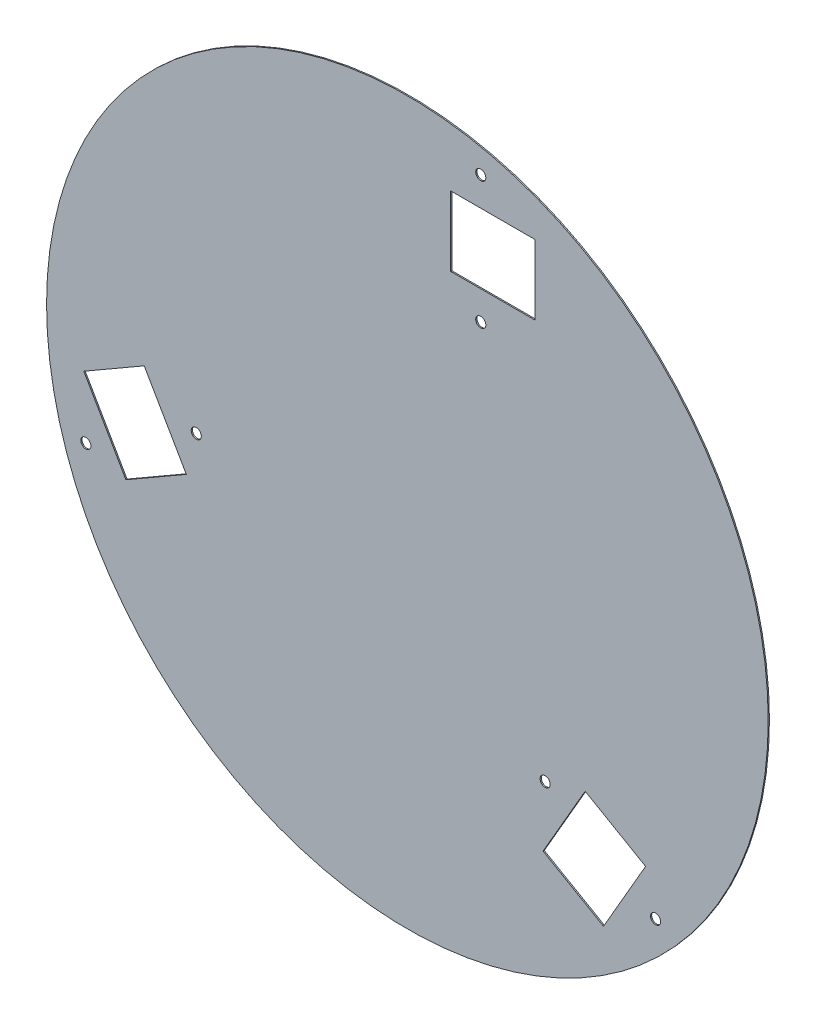
ISO-10303-21;
HEADER;
FILE_DESCRIPTION(('STEP AP214'),'2;1');
FILE_NAME('part.step','',(''),(''),'','','');
FILE_SCHEMA(('AUTOMOTIVE_DESIGN { 1 0 10303 214 1 1 1 1 }'));
ENDSEC;
DATA;
#1=APPLICATION_CONTEXT('core data for automotive mechanical design processes');
#2=APPLICATION_PROTOCOL_DEFINITION('international standard','automotive_design',2000,#1);
#3=PRODUCT_CONTEXT('',#1,'mechanical');
#4=PRODUCT('Part','Part','',(#3));
#5=PRODUCT_RELATED_PRODUCT_CATEGORY('part','',(#4));
#6=PRODUCT_DEFINITION_FORMATION('','',#4);
#7=PRODUCT_DEFINITION_CONTEXT('part definition',#1,'design');
#8=PRODUCT_DEFINITION('design','',#6,#7);
#9=PRODUCT_DEFINITION_SHAPE('','',#8);
#10=(LENGTH_UNIT() NAMED_UNIT(*) SI_UNIT(.MILLI.,.METRE.));
#11=(NAMED_UNIT(*) PLANE_ANGLE_UNIT() SI_UNIT($,.RADIAN.));
#12=(NAMED_UNIT(*) SI_UNIT($,.STERADIAN.) SOLID_ANGLE_UNIT());
#13=UNCERTAINTY_MEASURE_WITH_UNIT(LENGTH_MEASURE(1.E-05),#10,'distance_accuracy_value','');
#14=(GEOMETRIC_REPRESENTATION_CONTEXT(3) GLOBAL_UNCERTAINTY_ASSIGNED_CONTEXT((#13)) GLOBAL_UNIT_ASSIGNED_CONTEXT((#10,
#11,#12)) REPRESENTATION_CONTEXT('',''));
#15=CARTESIAN_POINT('',(0.,0.,0.));
#16=DIRECTION('',(0.,0.,1.));
#17=DIRECTION('',(1.,0.,0.));
#18=AXIS2_PLACEMENT_3D('',#15,#16,#17);
#19=CARTESIAN_POINT('',(0.,0.,0.5));
#20=DIRECTION('',(0.,0.,-1.));
#21=DIRECTION('',(-1.,0.,0.));
#22=AXIS2_PLACEMENT_3D('',#19,#20,#21);
#23=CYLINDRICAL_SURFACE('',#22,150.);
#24=CARTESIAN_POINT('',(0.,0.,0.5));
#25=DIRECTION('',(0.,0.,1.));
#26=DIRECTION('',(1.,0.,0.));
#27=AXIS2_PLACEMENT_3D('',#24,#25,#26);
#28=CIRCLE('',#27,150.);
#29=CARTESIAN_POINT('',(150.,0.,0.5));
#30=VERTEX_POINT('',#29);
#31=EDGE_CURVE('E198',#30,#30,#28,.T.);
#32=ORIENTED_EDGE('',*,*,#31,.F.);
#33=EDGE_LOOP('',(#32));
#34=FACE_BOUND('',#33,.T.);
#35=CARTESIAN_POINT('',(0.,0.,0.));
#36=DIRECTION('',(0.,0.,1.));
#37=DIRECTION('',(1.,0.,0.));
#38=AXIS2_PLACEMENT_3D('',#35,#36,#37);
#39=CIRCLE('',#38,150.);
#40=CARTESIAN_POINT('',(150.,0.,0.));
#41=VERTEX_POINT('',#40);
#42=EDGE_CURVE('E156',#41,#41,#39,.T.);
#43=ORIENTED_EDGE('',*,*,#42,.T.);
#44=EDGE_LOOP('',(#43));
#45=FACE_BOUND('',#44,.T.);
#46=ADVANCED_FACE('F37',(#34,#45),#23,.T.);
#47=CARTESIAN_POINT('',(0.,0.,0.5));
#48=DIRECTION('',(0.,0.,1.));
#49=DIRECTION('',(1.,0.,0.));
#50=AXIS2_PLACEMENT_3D('',#47,#48,#49);
#51=PLANE('',#50);
#52=CARTESIAN_POINT('',(-133.660108094979,-41.9503329679836,0.5));
#53=DIRECTION('',(0.,0.,1.));
#54=DIRECTION('',(1.,0.,0.));
#55=AXIS2_PLACEMENT_3D('',#52,#53,#54);
#56=CIRCLE('',#55,2.09999999999999);
#57=CARTESIAN_POINT('',(-131.560108094979,-41.9503329679836,0.5));
#58=VERTEX_POINT('',#57);
#59=EDGE_CURVE('E426',#58,#58,#56,.T.);
#60=ORIENTED_EDGE('',*,*,#59,.F.);
#61=EDGE_LOOP('',(#60));
#62=FACE_BOUND('',#61,.T.);
#63=CARTESIAN_POINT('',(57.2607616944042,-68.2778825988343,0.5));
#64=DIRECTION('',(0.,0.,1.));
#65=DIRECTION('',(1.,0.,0.));
#66=AXIS2_PLACEMENT_3D('',#63,#64,#65);
#67=CIRCLE('',#66,2.1);
#68=CARTESIAN_POINT('',(59.3607616944042,-68.2778825988343,0.5));
#69=VERTEX_POINT('',#68);
#70=EDGE_CURVE('E438',#69,#69,#67,.T.);
#71=ORIENTED_EDGE('',*,*,#70,.F.);
#72=EDGE_LOOP('',(#71));
#73=FACE_BOUND('',#72,.T.);
#74=CARTESIAN_POINT('',(-87.7607616944041,-15.4503329679836,0.5));
#75=DIRECTION('',(0.,0.,1.));
#76=DIRECTION('',(1.,0.,0.));
#77=AXIS2_PLACEMENT_3D('',#74,#75,#76);
#78=CIRCLE('',#77,2.1);
#79=CARTESIAN_POINT('',(-85.6607616944041,-15.4503329679836,0.5));
#80=VERTEX_POINT('',#79);
#81=EDGE_CURVE('E431',#80,#80,#78,.T.);
#82=ORIENTED_EDGE('',*,*,#81,.F.);
#83=EDGE_LOOP('',(#82));
#84=FACE_BOUND('',#83,.T.);
#85=CARTESIAN_POINT('',(30.5,136.728215566818,0.5));
#86=DIRECTION('',(0.,0.,1.));
#87=DIRECTION('',(1.,0.,0.));
#88=AXIS2_PLACEMENT_3D('',#85,#86,#87);
#89=CIRCLE('',#88,2.09999999999999);
#90=CARTESIAN_POINT('',(32.6,136.728215566818,0.5));
#91=VERTEX_POINT('',#90);
#92=EDGE_CURVE('E444',#91,#91,#89,.T.);
#93=ORIENTED_EDGE('',*,*,#92,.F.);
#94=EDGE_LOOP('',(#93));
#95=FACE_BOUND('',#94,.T.);
#96=CARTESIAN_POINT('',(30.5,83.728215566818,0.5));
#97=DIRECTION('',(0.,0.,1.));
#98=DIRECTION('',(1.,0.,0.));
#99=AXIS2_PLACEMENT_3D('',#96,#97,#98);
#100=CIRCLE('',#99,2.1);
#101=CARTESIAN_POINT('',(32.6,83.728215566818,0.5));
#102=VERTEX_POINT('',#101);
#103=EDGE_CURVE('E445',#102,#102,#100,.T.);
#104=ORIENTED_EDGE('',*,*,#103,.F.);
#105=EDGE_LOOP('',(#104));
#106=FACE_BOUND('',#105,.T.);
#107=CARTESIAN_POINT('',(103.160108094979,-94.7778825988344,0.5));
#108=DIRECTION('',(0.,0.,1.));
#109=DIRECTION('',(1.,0.,0.));
#110=AXIS2_PLACEMENT_3D('',#107,#108,#109);
#111=CIRCLE('',#110,2.1);
#112=CARTESIAN_POINT('',(105.26010809498,-94.7778825988344,0.5));
#113=VERTEX_POINT('',#112);
#114=EDGE_CURVE('E437',#113,#113,#111,.T.);
#115=ORIENTED_EDGE('',*,*,#114,.F.);
#116=EDGE_LOOP('',(#115));
#117=FACE_BOUND('',#116,.T.);
#118=DIRECTION('',(0.,-1.,0.));
#119=VECTOR('',#118,1.);
#120=CARTESIAN_POINT('',(18.,124.728215566818,0.5));
#121=LINE('',#120,#119);
#122=CARTESIAN_POINT('',(18.,124.728215566818,0.5));
#123=VERTEX_POINT('',#122);
#124=CARTESIAN_POINT('',(18.,95.728215566818,0.5));
#125=VERTEX_POINT('',#124);
#126=EDGE_CURVE('E51',#123,#125,#121,.T.);
#127=ORIENTED_EDGE('',*,*,#126,.F.);
#128=DIRECTION('',(-1.,0.,0.));
#129=VECTOR('',#128,1.);
#130=CARTESIAN_POINT('',(18.,124.728215566818,0.5));
#131=LINE('',#130,#129);
#132=CARTESIAN_POINT('',(53.,124.728215566818,0.5));
#133=VERTEX_POINT('',#132);
#134=EDGE_CURVE('E149',#133,#123,#131,.T.);
#135=ORIENTED_EDGE('',*,*,#134,.F.);
#136=DIRECTION('',(0.,1.,0.));
#137=VECTOR('',#136,1.);
#138=CARTESIAN_POINT('',(53.,124.728215566818,0.5));
#139=LINE('',#138,#137);
#140=CARTESIAN_POINT('',(53.,95.728215566818,0.5));
#141=VERTEX_POINT('',#140);
#142=EDGE_CURVE('E132',#141,#133,#139,.T.);
#143=ORIENTED_EDGE('',*,*,#142,.F.);
#144=DIRECTION('',(1.,0.,0.));
#145=VECTOR('',#144,1.);
#146=CARTESIAN_POINT('',(18.,95.728215566818,0.5));
#147=LINE('',#146,#145);
#148=EDGE_CURVE('E142',#125,#141,#147,.T.);
#149=ORIENTED_EDGE('',*,*,#148,.F.);
#150=EDGE_LOOP('',(#127,#135,#143,#149));
#151=FACE_BOUND('',#150,.T.);
#152=DIRECTION('',(-0.86602540378444,0.499999999999998,0.));
#153=VECTOR('',#152,1.);
#154=CARTESIAN_POINT('',(99.0178032495662,-77.9525650515289,0.5));
#155=LINE('',#154,#153);
#156=CARTESIAN_POINT('',(99.0178032495662,-77.9525650515289,0.5));
#157=VERTEX_POINT('',#156);
#158=CARTESIAN_POINT('',(73.9030665398174,-63.4525650515289,0.5));
#159=VERTEX_POINT('',#158);
#160=EDGE_CURVE('E59',#157,#159,#155,.T.);
#161=ORIENTED_EDGE('',*,*,#160,.F.);
#162=DIRECTION('',(0.499999999999998,0.86602540378444,0.));
#163=VECTOR('',#162,1.);
#164=CARTESIAN_POINT('',(81.5178032495662,-108.263454183984,0.5));
#165=LINE('',#164,#163);
#166=CARTESIAN_POINT('',(81.5178032495662,-108.263454183984,0.5));
#167=VERTEX_POINT('',#166);
#168=EDGE_CURVE('E167',#167,#157,#165,.T.);
#169=ORIENTED_EDGE('',*,*,#168,.F.);
#170=DIRECTION('',(0.86602540378444,-0.499999999999998,0.));
#171=VECTOR('',#170,1.);
#172=CARTESIAN_POINT('',(56.4030665398175,-93.7634541839843,0.5));
#173=LINE('',#172,#171);
#174=CARTESIAN_POINT('',(56.4030665398175,-93.7634541839843,0.5));
#175=VERTEX_POINT('',#174);
#176=EDGE_CURVE('E164',#175,#167,#173,.T.);
#177=ORIENTED_EDGE('',*,*,#176,.F.);
#178=DIRECTION('',(-0.499999999999998,-0.86602540378444,0.));
#179=VECTOR('',#178,1.);
#180=CARTESIAN_POINT('',(73.9030665398174,-63.4525650515289,0.5));
#181=LINE('',#180,#179);
#182=EDGE_CURVE('E160',#159,#175,#181,.T.);
#183=ORIENTED_EDGE('',*,*,#182,.F.);
#184=EDGE_LOOP('',(#161,#169,#177,#183));
#185=FACE_BOUND('',#184,.T.);
#186=DIRECTION('',(-0.866025403784439,-0.499999999999999,0.));
#187=VECTOR('',#186,1.);
#188=CARTESIAN_POINT('',(-134.517803249566,-16.4647613828338,0.5));
#189=LINE('',#188,#187);
#190=CARTESIAN_POINT('',(-109.403066539817,-1.9647613828338,0.5));
#191=VERTEX_POINT('',#190);
#192=CARTESIAN_POINT('',(-134.517803249566,-16.4647613828338,0.5));
#193=VERTEX_POINT('',#192);
#194=EDGE_CURVE('E178',#191,#193,#189,.T.);
#195=ORIENTED_EDGE('',*,*,#194,.F.);
#196=DIRECTION('',(-0.5,0.866025403784439,0.));
#197=VECTOR('',#196,1.);
#198=CARTESIAN_POINT('',(-109.403066539817,-1.9647613828338,0.5));
#199=LINE('',#198,#197);
#200=CARTESIAN_POINT('',(-91.9030665398173,-32.2756505152891,0.5));
#201=VERTEX_POINT('',#200);
#202=EDGE_CURVE('E187',#201,#191,#199,.T.);
#203=ORIENTED_EDGE('',*,*,#202,.F.);
#204=DIRECTION('',(0.866025403784439,0.5,0.));
#205=VECTOR('',#204,1.);
#206=CARTESIAN_POINT('',(-91.9030665398173,-32.2756505152891,0.5));
#207=LINE('',#206,#205);
#208=CARTESIAN_POINT('',(-117.017803249566,-46.7756505152891,0.5));
#209=VERTEX_POINT('',#208);
#210=EDGE_CURVE('E184',#209,#201,#207,.T.);
#211=ORIENTED_EDGE('',*,*,#210,.F.);
#212=DIRECTION('',(0.5,-0.866025403784439,0.));
#213=VECTOR('',#212,1.);
#214=CARTESIAN_POINT('',(-117.017803249566,-46.7756505152891,0.5));
#215=LINE('',#214,#213);
#216=EDGE_CURVE('E180',#193,#209,#215,.T.);
#217=ORIENTED_EDGE('',*,*,#216,.F.);
#218=EDGE_LOOP('',(#195,#203,#211,#217));
#219=FACE_BOUND('',#218,.T.);
#220=ORIENTED_EDGE('',*,*,#31,.T.);
#221=EDGE_LOOP('',(#220));
#222=FACE_BOUND('',#221,.T.);
#223=ADVANCED_FACE('F146',(#62,#73,#84,#95,#106,#117,#151,#185,#219,#222),#51,.T.);
#224=CARTESIAN_POINT('',(0.,0.,0.));
#225=DIRECTION('',(0.,0.,1.));
#226=DIRECTION('',(1.,0.,0.));
#227=AXIS2_PLACEMENT_3D('',#224,#225,#226);
#228=PLANE('',#227);
#229=CARTESIAN_POINT('',(-133.660108094979,-41.9503329679836,0.));
#230=DIRECTION('',(0.,0.,1.));
#231=DIRECTION('',(1.,0.,0.));
#232=AXIS2_PLACEMENT_3D('',#229,#230,#231);
#233=CIRCLE('',#232,2.09999999999999);
#234=CARTESIAN_POINT('',(-131.560108094979,-41.9503329679836,0.));
#235=VERTEX_POINT('',#234);
#236=EDGE_CURVE('E181',#235,#235,#233,.T.);
#237=ORIENTED_EDGE('',*,*,#236,.T.);
#238=EDGE_LOOP('',(#237));
#239=FACE_BOUND('',#238,.T.);
#240=CARTESIAN_POINT('',(57.2607616944042,-68.2778825988343,0.));
#241=DIRECTION('',(0.,0.,1.));
#242=DIRECTION('',(1.,0.,0.));
#243=AXIS2_PLACEMENT_3D('',#240,#241,#242);
#244=CIRCLE('',#243,2.1);
#245=CARTESIAN_POINT('',(59.3607616944042,-68.2778825988343,0.));
#246=VERTEX_POINT('',#245);
#247=EDGE_CURVE('E434',#246,#246,#244,.T.);
#248=ORIENTED_EDGE('',*,*,#247,.T.);
#249=EDGE_LOOP('',(#248));
#250=FACE_BOUND('',#249,.T.);
#251=CARTESIAN_POINT('',(-87.7607616944041,-15.4503329679836,0.));
#252=DIRECTION('',(0.,0.,1.));
#253=DIRECTION('',(1.,0.,0.));
#254=AXIS2_PLACEMENT_3D('',#251,#252,#253);
#255=CIRCLE('',#254,2.1);
#256=CARTESIAN_POINT('',(-85.6607616944041,-15.4503329679836,0.));
#257=VERTEX_POINT('',#256);
#258=EDGE_CURVE('E427',#257,#257,#255,.T.);
#259=ORIENTED_EDGE('',*,*,#258,.T.);
#260=EDGE_LOOP('',(#259));
#261=FACE_BOUND('',#260,.T.);
#262=CARTESIAN_POINT('',(30.5,136.728215566818,0.));
#263=DIRECTION('',(0.,0.,1.));
#264=DIRECTION('',(1.,0.,0.));
#265=AXIS2_PLACEMENT_3D('',#262,#263,#264);
#266=CIRCLE('',#265,2.09999999999999);
#267=CARTESIAN_POINT('',(32.6,136.728215566818,0.));
#268=VERTEX_POINT('',#267);
#269=EDGE_CURVE('E455',#268,#268,#266,.T.);
#270=ORIENTED_EDGE('',*,*,#269,.T.);
#271=EDGE_LOOP('',(#270));
#272=FACE_BOUND('',#271,.T.);
#273=CARTESIAN_POINT('',(30.5,83.728215566818,0.));
#274=DIRECTION('',(0.,0.,1.));
#275=DIRECTION('',(1.,0.,0.));
#276=AXIS2_PLACEMENT_3D('',#273,#274,#275);
#277=CIRCLE('',#276,2.1);
#278=CARTESIAN_POINT('',(32.6,83.728215566818,0.));
#279=VERTEX_POINT('',#278);
#280=EDGE_CURVE('E441',#279,#279,#277,.T.);
#281=ORIENTED_EDGE('',*,*,#280,.T.);
#282=EDGE_LOOP('',(#281));
#283=FACE_BOUND('',#282,.T.);
#284=CARTESIAN_POINT('',(103.160108094979,-94.7778825988344,0.));
#285=DIRECTION('',(0.,0.,1.));
#286=DIRECTION('',(1.,0.,0.));
#287=AXIS2_PLACEMENT_3D('',#284,#285,#286);
#288=CIRCLE('',#287,2.1);
#289=CARTESIAN_POINT('',(105.26010809498,-94.7778825988344,0.));
#290=VERTEX_POINT('',#289);
#291=EDGE_CURVE('E448',#290,#290,#288,.T.);
#292=ORIENTED_EDGE('',*,*,#291,.T.);
#293=EDGE_LOOP('',(#292));
#294=FACE_BOUND('',#293,.T.);
#295=DIRECTION('',(-1.,0.,0.));
#296=VECTOR('',#295,1.);
#297=CARTESIAN_POINT('',(0.,124.728215566818,0.));
#298=LINE('',#297,#296);
#299=CARTESIAN_POINT('',(53.,124.728215566818,0.));
#300=VERTEX_POINT('',#299);
#301=CARTESIAN_POINT('',(18.,124.728215566818,0.));
#302=VERTEX_POINT('',#301);
#303=EDGE_CURVE('E44',#300,#302,#298,.T.);
#304=ORIENTED_EDGE('',*,*,#303,.T.);
#305=DIRECTION('',(0.,-1.,0.));
#306=VECTOR('',#305,1.);
#307=CARTESIAN_POINT('',(18.,0.,0.));
#308=LINE('',#307,#306);
#309=CARTESIAN_POINT('',(18.,95.728215566818,0.));
#310=VERTEX_POINT('',#309);
#311=EDGE_CURVE('E11',#302,#310,#308,.T.);
#312=ORIENTED_EDGE('',*,*,#311,.T.);
#313=DIRECTION('',(1.,0.,0.));
#314=VECTOR('',#313,1.);
#315=CARTESIAN_POINT('',(0.,95.728215566818,0.));
#316=LINE('',#315,#314);
#317=CARTESIAN_POINT('',(53.,95.728215566818,0.));
#318=VERTEX_POINT('',#317);
#319=EDGE_CURVE('E227',#310,#318,#316,.T.);
#320=ORIENTED_EDGE('',*,*,#319,.T.);
#321=DIRECTION('',(0.,1.,0.));
#322=VECTOR('',#321,1.);
#323=CARTESIAN_POINT('',(53.,0.,0.));
#324=LINE('',#323,#322);
#325=EDGE_CURVE('E135',#318,#300,#324,.T.);
#326=ORIENTED_EDGE('',*,*,#325,.T.);
#327=EDGE_LOOP('',(#304,#312,#320,#326));
#328=FACE_BOUND('',#327,.T.);
#329=DIRECTION('',(0.499999999999998,0.86602540378444,0.));
#330=VECTOR('',#329,1.);
#331=CARTESIAN_POINT('',(108.017803249566,-62.3641077834087,0.));
#332=LINE('',#331,#330);
#333=CARTESIAN_POINT('',(81.5178032495662,-108.263454183984,0.));
#334=VERTEX_POINT('',#333);
#335=CARTESIAN_POINT('',(99.0178032495662,-77.9525650515289,0.));
#336=VERTEX_POINT('',#335);
#337=EDGE_CURVE('E221',#334,#336,#332,.T.);
#338=ORIENTED_EDGE('',*,*,#337,.T.);
#339=DIRECTION('',(-0.86602540378444,0.499999999999998,0.));
#340=VECTOR('',#339,1.);
#341=CARTESIAN_POINT('',(-9.00000000000005,-15.5884572681201,0.));
#342=LINE('',#341,#340);
#343=CARTESIAN_POINT('',(73.9030665398174,-63.4525650515289,0.));
#344=VERTEX_POINT('',#343);
#345=EDGE_CURVE('E224',#336,#344,#342,.T.);
#346=ORIENTED_EDGE('',*,*,#345,.T.);
#347=DIRECTION('',(-0.499999999999998,-0.86602540378444,0.));
#348=VECTOR('',#347,1.);
#349=CARTESIAN_POINT('',(82.9030665398175,-47.8641077834088,0.));
#350=LINE('',#349,#348);
#351=CARTESIAN_POINT('',(56.4030665398175,-93.7634541839843,0.));
#352=VERTEX_POINT('',#351);
#353=EDGE_CURVE('E215',#344,#352,#350,.T.);
#354=ORIENTED_EDGE('',*,*,#353,.T.);
#355=DIRECTION('',(0.86602540378444,-0.499999999999998,0.));
#356=VECTOR('',#355,1.);
#357=CARTESIAN_POINT('',(-26.5,-45.8993464005755,0.));
#358=LINE('',#357,#356);
#359=EDGE_CURVE('E218',#352,#334,#358,.T.);
#360=ORIENTED_EDGE('',*,*,#359,.T.);
#361=EDGE_LOOP('',(#338,#346,#354,#360));
#362=FACE_BOUND('',#361,.T.);
#363=DIRECTION('',(-0.5,0.866025403784439,0.));
#364=VECTOR('',#363,1.);
#365=CARTESIAN_POINT('',(-82.9030665398174,-47.864107783409,0.));
#366=LINE('',#365,#364);
#367=CARTESIAN_POINT('',(-91.9030665398173,-32.2756505152891,0.));
#368=VERTEX_POINT('',#367);
#369=CARTESIAN_POINT('',(-109.403066539817,-1.9647613828338,0.));
#370=VERTEX_POINT('',#369);
#371=EDGE_CURVE('E209',#368,#370,#366,.T.);
#372=ORIENTED_EDGE('',*,*,#371,.T.);
#373=DIRECTION('',(-0.866025403784439,-0.499999999999999,0.));
#374=VECTOR('',#373,1.);
#375=CARTESIAN_POINT('',(-26.4999999999999,45.8993464005751,0.));
#376=LINE('',#375,#374);
#377=CARTESIAN_POINT('',(-134.517803249566,-16.4647613828338,0.));
#378=VERTEX_POINT('',#377);
#379=EDGE_CURVE('E212',#370,#378,#376,.T.);
#380=ORIENTED_EDGE('',*,*,#379,.T.);
#381=DIRECTION('',(0.5,-0.866025403784439,0.));
#382=VECTOR('',#381,1.);
#383=CARTESIAN_POINT('',(-108.017803249566,-62.364107783409,0.));
#384=LINE('',#383,#382);
#385=CARTESIAN_POINT('',(-117.017803249566,-46.7756505152891,0.));
#386=VERTEX_POINT('',#385);
#387=EDGE_CURVE('E201',#378,#386,#384,.T.);
#388=ORIENTED_EDGE('',*,*,#387,.T.);
#389=DIRECTION('',(0.866025403784439,0.5,0.));
#390=VECTOR('',#389,1.);
#391=CARTESIAN_POINT('',(-8.99999999999999,15.5884572681199,0.));
#392=LINE('',#391,#390);
#393=EDGE_CURVE('E206',#386,#368,#392,.T.);
#394=ORIENTED_EDGE('',*,*,#393,.T.);
#395=EDGE_LOOP('',(#372,#380,#388,#394));
#396=FACE_BOUND('',#395,.T.);
#397=ORIENTED_EDGE('',*,*,#42,.F.);
#398=EDGE_LOOP('',(#397));
#399=FACE_BOUND('',#398,.T.);
#400=ADVANCED_FACE('F231',(#239,#250,#261,#272,#283,#294,#328,#362,#396,#399),#228,.F.);
#401=CARTESIAN_POINT('',(-134.517803249566,-16.4647613828338,-2.675));
#402=DIRECTION('',(-0.499999999999999,0.866025403784439,0.));
#403=DIRECTION('',(-0.866025403784439,-0.499999999999999,0.));
#404=AXIS2_PLACEMENT_3D('',#401,#402,#403);
#405=PLANE('',#404);
#406=DIRECTION('',(0.,0.,1.));
#407=VECTOR('',#406,1.);
#408=CARTESIAN_POINT('',(-109.403066539817,-1.9647613828338,-2.675));
#409=LINE('',#408,#407);
#410=EDGE_CURVE('E161',#370,#191,#409,.T.);
#411=ORIENTED_EDGE('',*,*,#410,.T.);
#412=ORIENTED_EDGE('',*,*,#194,.T.);
#413=DIRECTION('',(0.,0.,1.));
#414=VECTOR('',#413,1.);
#415=CARTESIAN_POINT('',(-134.517803249566,-16.4647613828338,-2.675));
#416=LINE('',#415,#414);
#417=EDGE_CURVE('E190',#378,#193,#416,.T.);
#418=ORIENTED_EDGE('',*,*,#417,.F.);
#419=ORIENTED_EDGE('',*,*,#379,.F.);
#420=EDGE_LOOP('',(#411,#412,#418,#419));
#421=FACE_BOUND('',#420,.T.);
#422=ADVANCED_FACE('F262',(#421),#405,.F.);
#423=CARTESIAN_POINT('',(-109.403066539817,-1.9647613828338,-2.675));
#424=DIRECTION('',(0.866025403784439,0.5,0.));
#425=DIRECTION('',(-0.5,0.866025403784439,0.));
#426=AXIS2_PLACEMENT_3D('',#423,#424,#425);
#427=PLANE('',#426);
#428=DIRECTION('',(0.,0.,1.));
#429=VECTOR('',#428,1.);
#430=CARTESIAN_POINT('',(-91.9030665398173,-32.2756505152891,-2.675));
#431=LINE('',#430,#429);
#432=EDGE_CURVE('E192',#368,#201,#431,.T.);
#433=ORIENTED_EDGE('',*,*,#432,.T.);
#434=ORIENTED_EDGE('',*,*,#202,.T.);
#435=ORIENTED_EDGE('',*,*,#410,.F.);
#436=ORIENTED_EDGE('',*,*,#371,.F.);
#437=EDGE_LOOP('',(#433,#434,#435,#436));
#438=FACE_BOUND('',#437,.T.);
#439=ADVANCED_FACE('F267',(#438),#427,.F.);
#440=CARTESIAN_POINT('',(-91.9030665398173,-32.2756505152891,-2.675));
#441=DIRECTION('',(0.5,-0.866025403784439,0.));
#442=DIRECTION('',(0.866025403784439,0.5,0.));
#443=AXIS2_PLACEMENT_3D('',#440,#441,#442);
#444=PLANE('',#443);
#445=DIRECTION('',(0.,0.,1.));
#446=VECTOR('',#445,1.);
#447=CARTESIAN_POINT('',(-117.017803249566,-46.7756505152891,-2.675));
#448=LINE('',#447,#446);
#449=EDGE_CURVE('E194',#386,#209,#448,.T.);
#450=ORIENTED_EDGE('',*,*,#449,.T.);
#451=ORIENTED_EDGE('',*,*,#210,.T.);
#452=ORIENTED_EDGE('',*,*,#432,.F.);
#453=ORIENTED_EDGE('',*,*,#393,.F.);
#454=EDGE_LOOP('',(#450,#451,#452,#453));
#455=FACE_BOUND('',#454,.T.);
#456=ADVANCED_FACE('F277',(#455),#444,.F.);
#457=CARTESIAN_POINT('',(-117.017803249566,-46.7756505152891,-2.675));
#458=DIRECTION('',(-0.866025403784439,-0.5,0.));
#459=DIRECTION('',(0.5,-0.866025403784439,0.));
#460=AXIS2_PLACEMENT_3D('',#457,#458,#459);
#461=PLANE('',#460);
#462=ORIENTED_EDGE('',*,*,#417,.T.);
#463=ORIENTED_EDGE('',*,*,#216,.T.);
#464=ORIENTED_EDGE('',*,*,#449,.F.);
#465=ORIENTED_EDGE('',*,*,#387,.F.);
#466=EDGE_LOOP('',(#462,#463,#464,#465));
#467=FACE_BOUND('',#466,.T.);
#468=ADVANCED_FACE('F273',(#467),#461,.F.);
#469=CARTESIAN_POINT('',(99.0178032495662,-77.9525650515289,-2.675));
#470=DIRECTION('',(0.499999999999998,0.866025403784439,0.));
#471=DIRECTION('',(-0.86602540378444,0.499999999999998,0.));
#472=AXIS2_PLACEMENT_3D('',#469,#470,#471);
#473=PLANE('',#472);
#474=DIRECTION('',(0.,0.,1.));
#475=VECTOR('',#474,1.);
#476=CARTESIAN_POINT('',(99.0178032495662,-77.9525650515289,-2.675));
#477=LINE('',#476,#475);
#478=EDGE_CURVE('E171',#336,#157,#477,.T.);
#479=ORIENTED_EDGE('',*,*,#478,.T.);
#480=ORIENTED_EDGE('',*,*,#160,.T.);
#481=DIRECTION('',(0.,0.,1.));
#482=VECTOR('',#481,1.);
#483=CARTESIAN_POINT('',(73.9030665398174,-63.4525650515289,-2.675));
#484=LINE('',#483,#482);
#485=EDGE_CURVE('E170',#344,#159,#484,.T.);
#486=ORIENTED_EDGE('',*,*,#485,.F.);
#487=ORIENTED_EDGE('',*,*,#345,.F.);
#488=EDGE_LOOP('',(#479,#480,#486,#487));
#489=FACE_BOUND('',#488,.T.);
#490=ADVANCED_FACE('F276',(#489),#473,.F.);
#491=CARTESIAN_POINT('',(81.5178032495662,-108.263454183984,-2.675));
#492=DIRECTION('',(0.86602540378444,-0.499999999999998,0.));
#493=DIRECTION('',(0.499999999999998,0.86602540378444,0.));
#494=AXIS2_PLACEMENT_3D('',#491,#492,#493);
#495=PLANE('',#494);
#496=DIRECTION('',(0.,0.,1.));
#497=VECTOR('',#496,1.);
#498=CARTESIAN_POINT('',(81.5178032495662,-108.263454183984,-2.675));
#499=LINE('',#498,#497);
#500=EDGE_CURVE('E173',#334,#167,#499,.T.);
#501=ORIENTED_EDGE('',*,*,#500,.T.);
#502=ORIENTED_EDGE('',*,*,#168,.T.);
#503=ORIENTED_EDGE('',*,*,#478,.F.);
#504=ORIENTED_EDGE('',*,*,#337,.F.);
#505=EDGE_LOOP('',(#501,#502,#503,#504));
#506=FACE_BOUND('',#505,.T.);
#507=ADVANCED_FACE('F286',(#506),#495,.F.);
#508=CARTESIAN_POINT('',(56.4030665398175,-93.7634541839843,-2.675));
#509=DIRECTION('',(-0.499999999999998,-0.86602540378444,0.));
#510=DIRECTION('',(0.86602540378444,-0.499999999999998,0.));
#511=AXIS2_PLACEMENT_3D('',#508,#509,#510);
#512=PLANE('',#511);
#513=DIRECTION('',(0.,0.,1.));
#514=VECTOR('',#513,1.);
#515=CARTESIAN_POINT('',(56.4030665398175,-93.7634541839843,-2.675));
#516=LINE('',#515,#514);
#517=EDGE_CURVE('E175',#352,#175,#516,.T.);
#518=ORIENTED_EDGE('',*,*,#517,.T.);
#519=ORIENTED_EDGE('',*,*,#176,.T.);
#520=ORIENTED_EDGE('',*,*,#500,.F.);
#521=ORIENTED_EDGE('',*,*,#359,.F.);
#522=EDGE_LOOP('',(#518,#519,#520,#521));
#523=FACE_BOUND('',#522,.T.);
#524=ADVANCED_FACE('F245',(#523),#512,.F.);
#525=CARTESIAN_POINT('',(73.9030665398174,-63.4525650515289,-2.675));
#526=DIRECTION('',(-0.86602540378444,0.499999999999998,0.));
#527=DIRECTION('',(-0.499999999999998,-0.86602540378444,0.));
#528=AXIS2_PLACEMENT_3D('',#525,#526,#527);
#529=PLANE('',#528);
#530=ORIENTED_EDGE('',*,*,#485,.T.);
#531=ORIENTED_EDGE('',*,*,#182,.T.);
#532=ORIENTED_EDGE('',*,*,#517,.F.);
#533=ORIENTED_EDGE('',*,*,#353,.F.);
#534=EDGE_LOOP('',(#530,#531,#532,#533));
#535=FACE_BOUND('',#534,.T.);
#536=ADVANCED_FACE('F238',(#535),#529,.F.);
#537=CARTESIAN_POINT('',(18.,124.728215566818,-2.675));
#538=DIRECTION('',(-1.,0.,0.));
#539=DIRECTION('',(0.,-1.,0.));
#540=AXIS2_PLACEMENT_3D('',#537,#538,#539);
#541=PLANE('',#540);
#542=DIRECTION('',(0.,0.,1.));
#543=VECTOR('',#542,1.);
#544=CARTESIAN_POINT('',(18.,124.728215566818,-2.675));
#545=LINE('',#544,#543);
#546=EDGE_CURVE('E154',#302,#123,#545,.T.);
#547=ORIENTED_EDGE('',*,*,#546,.T.);
#548=ORIENTED_EDGE('',*,*,#126,.T.);
#549=DIRECTION('',(0.,0.,1.));
#550=VECTOR('',#549,1.);
#551=CARTESIAN_POINT('',(18.,95.728215566818,-2.675));
#552=LINE('',#551,#550);
#553=EDGE_CURVE('E139',#310,#125,#552,.T.);
#554=ORIENTED_EDGE('',*,*,#553,.F.);
#555=ORIENTED_EDGE('',*,*,#311,.F.);
#556=EDGE_LOOP('',(#547,#548,#554,#555));
#557=FACE_BOUND('',#556,.T.);
#558=ADVANCED_FACE('F236',(#557),#541,.F.);
#559=CARTESIAN_POINT('',(18.,124.728215566818,-2.675));
#560=DIRECTION('',(0.,1.,0.));
#561=DIRECTION('',(0.,0.,1.));
#562=AXIS2_PLACEMENT_3D('',#559,#560,#561);
#563=PLANE('',#562);
#564=DIRECTION('',(0.,0.,1.));
#565=VECTOR('',#564,1.);
#566=CARTESIAN_POINT('',(53.,124.728215566818,-2.675));
#567=LINE('',#566,#565);
#568=EDGE_CURVE('E138',#300,#133,#567,.T.);
#569=ORIENTED_EDGE('',*,*,#568,.T.);
#570=ORIENTED_EDGE('',*,*,#134,.T.);
#571=ORIENTED_EDGE('',*,*,#546,.F.);
#572=ORIENTED_EDGE('',*,*,#303,.F.);
#573=EDGE_LOOP('',(#569,#570,#571,#572));
#574=FACE_BOUND('',#573,.T.);
#575=ADVANCED_FACE('F235',(#574),#563,.F.);
#576=CARTESIAN_POINT('',(53.,124.728215566818,-2.675));
#577=DIRECTION('',(1.,0.,0.));
#578=DIRECTION('',(0.,1.,0.));
#579=AXIS2_PLACEMENT_3D('',#576,#577,#578);
#580=PLANE('',#579);
#581=DIRECTION('',(0.,0.,1.));
#582=VECTOR('',#581,1.);
#583=CARTESIAN_POINT('',(53.,95.728215566818,-2.675));
#584=LINE('',#583,#582);
#585=EDGE_CURVE('E127',#318,#141,#584,.T.);
#586=ORIENTED_EDGE('',*,*,#585,.T.);
#587=ORIENTED_EDGE('',*,*,#142,.T.);
#588=ORIENTED_EDGE('',*,*,#568,.F.);
#589=ORIENTED_EDGE('',*,*,#325,.F.);
#590=EDGE_LOOP('',(#586,#587,#588,#589));
#591=FACE_BOUND('',#590,.T.);
#592=ADVANCED_FACE('F129',(#591),#580,.F.);
#593=CARTESIAN_POINT('',(18.,95.728215566818,-2.675));
#594=DIRECTION('',(0.,-1.,0.));
#595=DIRECTION('',(1.,0.,0.));
#596=AXIS2_PLACEMENT_3D('',#593,#594,#595);
#597=PLANE('',#596);
#598=ORIENTED_EDGE('',*,*,#553,.T.);
#599=ORIENTED_EDGE('',*,*,#148,.T.);
#600=ORIENTED_EDGE('',*,*,#585,.F.);
#601=ORIENTED_EDGE('',*,*,#319,.F.);
#602=EDGE_LOOP('',(#598,#599,#600,#601));
#603=FACE_BOUND('',#602,.T.);
#604=ADVANCED_FACE('F143',(#603),#597,.F.);
#605=CARTESIAN_POINT('',(103.160108094979,-94.7778825988344,0.));
#606=DIRECTION('',(0.,0.,1.));
#607=DIRECTION('',(1.,0.,0.));
#608=AXIS2_PLACEMENT_3D('',#605,#606,#607);
#609=CYLINDRICAL_SURFACE('',#608,2.1);
#610=ORIENTED_EDGE('',*,*,#291,.F.);
#611=EDGE_LOOP('',(#610));
#612=FACE_BOUND('',#611,.T.);
#613=ORIENTED_EDGE('',*,*,#114,.T.);
#614=EDGE_LOOP('',(#613));
#615=FACE_BOUND('',#614,.T.);
#616=ADVANCED_FACE('F348',(#612,#615),#609,.F.);
#617=CARTESIAN_POINT('',(30.5,83.728215566818,0.));
#618=DIRECTION('',(0.,0.,1.));
#619=DIRECTION('',(1.,0.,0.));
#620=AXIS2_PLACEMENT_3D('',#617,#618,#619);
#621=CYLINDRICAL_SURFACE('',#620,2.1);
#622=ORIENTED_EDGE('',*,*,#280,.F.);
#623=EDGE_LOOP('',(#622));
#624=FACE_BOUND('',#623,.T.);
#625=ORIENTED_EDGE('',*,*,#103,.T.);
#626=EDGE_LOOP('',(#625));
#627=FACE_BOUND('',#626,.T.);
#628=ADVANCED_FACE('F368',(#624,#627),#621,.F.);
#629=CARTESIAN_POINT('',(30.5,136.728215566818,0.));
#630=DIRECTION('',(0.,0.,1.));
#631=DIRECTION('',(1.,0.,0.));
#632=AXIS2_PLACEMENT_3D('',#629,#630,#631);
#633=CYLINDRICAL_SURFACE('',#632,2.09999999999999);
#634=ORIENTED_EDGE('',*,*,#269,.F.);
#635=EDGE_LOOP('',(#634));
#636=FACE_BOUND('',#635,.T.);
#637=ORIENTED_EDGE('',*,*,#92,.T.);
#638=EDGE_LOOP('',(#637));
#639=FACE_BOUND('',#638,.T.);
#640=ADVANCED_FACE('F378',(#636,#639),#633,.F.);
#641=CARTESIAN_POINT('',(-87.7607616944041,-15.4503329679836,0.));
#642=DIRECTION('',(0.,0.,1.));
#643=DIRECTION('',(1.,0.,0.));
#644=AXIS2_PLACEMENT_3D('',#641,#642,#643);
#645=CYLINDRICAL_SURFACE('',#644,2.1);
#646=ORIENTED_EDGE('',*,*,#258,.F.);
#647=EDGE_LOOP('',(#646));
#648=FACE_BOUND('',#647,.T.);
#649=ORIENTED_EDGE('',*,*,#81,.T.);
#650=EDGE_LOOP('',(#649));
#651=FACE_BOUND('',#650,.T.);
#652=ADVANCED_FACE('F388',(#648,#651),#645,.F.);
#653=CARTESIAN_POINT('',(57.2607616944042,-68.2778825988343,0.));
#654=DIRECTION('',(0.,0.,1.));
#655=DIRECTION('',(1.,0.,0.));
#656=AXIS2_PLACEMENT_3D('',#653,#654,#655);
#657=CYLINDRICAL_SURFACE('',#656,2.1);
#658=ORIENTED_EDGE('',*,*,#247,.F.);
#659=EDGE_LOOP('',(#658));
#660=FACE_BOUND('',#659,.T.);
#661=ORIENTED_EDGE('',*,*,#70,.T.);
#662=EDGE_LOOP('',(#661));
#663=FACE_BOUND('',#662,.T.);
#664=ADVANCED_FACE('F398',(#660,#663),#657,.F.);
#665=CARTESIAN_POINT('',(-133.660108094979,-41.9503329679836,0.));
#666=DIRECTION('',(0.,0.,1.));
#667=DIRECTION('',(1.,0.,0.));
#668=AXIS2_PLACEMENT_3D('',#665,#666,#667);
#669=CYLINDRICAL_SURFACE('',#668,2.09999999999999);
#670=ORIENTED_EDGE('',*,*,#236,.F.);
#671=EDGE_LOOP('',(#670));
#672=FACE_BOUND('',#671,.T.);
#673=ORIENTED_EDGE('',*,*,#59,.T.);
#674=EDGE_LOOP('',(#673));
#675=FACE_BOUND('',#674,.T.);
#676=ADVANCED_FACE('F408',(#672,#675),#669,.F.);
#677=CLOSED_SHELL('',(#46,#223,#400,#422,#439,#456,#468,#490,#507,#524,#536,#558,#575,#592,#604,
#616,#628,#640,#652,#664,#676));
#678=MANIFOLD_SOLID_BREP('B2',#677);
#679=ADVANCED_BREP_SHAPE_REPRESENTATION('',(#18,#678),#14);
#680=SHAPE_DEFINITION_REPRESENTATION(#9,#679);
ENDSEC;
END-ISO-10303-21;
